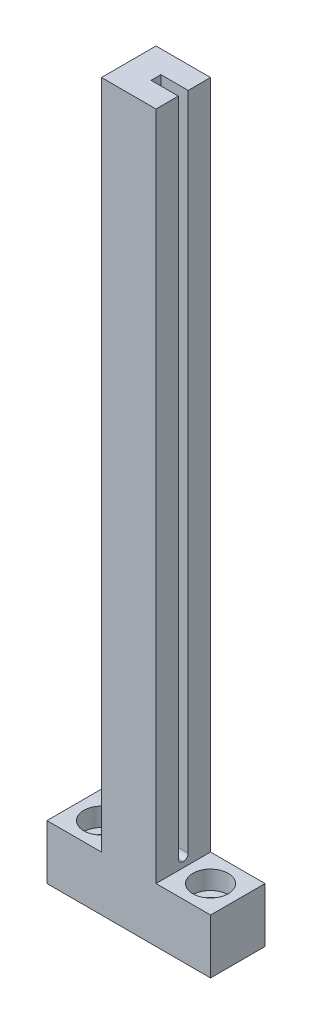
ISO-10303-21;
HEADER;
FILE_DESCRIPTION(('STEP AP214'),'2;1');
FILE_NAME('part.step','',(''),(''),'','','');
FILE_SCHEMA(('AUTOMOTIVE_DESIGN { 1 0 10303 214 1 1 1 1 }'));
ENDSEC;
DATA;
#1=APPLICATION_CONTEXT('core data for automotive mechanical design processes');
#2=APPLICATION_PROTOCOL_DEFINITION('international standard','automotive_design',2000,#1);
#3=PRODUCT_CONTEXT('',#1,'mechanical');
#4=PRODUCT('Part','Part','',(#3));
#5=PRODUCT_RELATED_PRODUCT_CATEGORY('part','',(#4));
#6=PRODUCT_DEFINITION_FORMATION('','',#4);
#7=PRODUCT_DEFINITION_CONTEXT('part definition',#1,'design');
#8=PRODUCT_DEFINITION('design','',#6,#7);
#9=PRODUCT_DEFINITION_SHAPE('','',#8);
#10=(LENGTH_UNIT() NAMED_UNIT(*) SI_UNIT(.MILLI.,.METRE.));
#11=(NAMED_UNIT(*) PLANE_ANGLE_UNIT() SI_UNIT($,.RADIAN.));
#12=(NAMED_UNIT(*) SI_UNIT($,.STERADIAN.) SOLID_ANGLE_UNIT());
#13=UNCERTAINTY_MEASURE_WITH_UNIT(LENGTH_MEASURE(1.E-05),#10,'distance_accuracy_value','');
#14=(GEOMETRIC_REPRESENTATION_CONTEXT(3) GLOBAL_UNCERTAINTY_ASSIGNED_CONTEXT((#13)) GLOBAL_UNIT_ASSIGNED_CONTEXT((#10,
#11,#12)) REPRESENTATION_CONTEXT('',''));
#15=CARTESIAN_POINT('',(0.,0.,0.));
#16=DIRECTION('',(0.,0.,1.));
#17=DIRECTION('',(1.,0.,0.));
#18=AXIS2_PLACEMENT_3D('',#15,#16,#17);
#19=CARTESIAN_POINT('',(5.,133.,-5.));
#20=DIRECTION('',(-1.,0.,0.));
#21=DIRECTION('',(0.,0.,1.));
#22=AXIS2_PLACEMENT_3D('',#19,#20,#21);
#23=PLANE('',#22);
#24=DIRECTION('',(0.,0.,1.));
#25=VECTOR('',#24,1.);
#26=CARTESIAN_POINT('',(5.,9.99999999999999,-5.));
#27=LINE('',#26,#25);
#28=CARTESIAN_POINT('',(5.,9.99999999999999,-5.));
#29=VERTEX_POINT('',#28);
#30=CARTESIAN_POINT('',(5.,10.,5.));
#31=VERTEX_POINT('',#30);
#32=EDGE_CURVE('E48',#29,#31,#27,.T.);
#33=ORIENTED_EDGE('',*,*,#32,.F.);
#34=DIRECTION('',(0.,-1.,0.));
#35=VECTOR('',#34,1.);
#36=CARTESIAN_POINT('',(5.,133.,-5.));
#37=LINE('',#36,#35);
#38=CARTESIAN_POINT('',(5.,133.,-5.));
#39=VERTEX_POINT('',#38);
#40=EDGE_CURVE('E239',#39,#29,#37,.T.);
#41=ORIENTED_EDGE('',*,*,#40,.F.);
#42=DIRECTION('',(0.,0.,-1.));
#43=VECTOR('',#42,1.);
#44=CARTESIAN_POINT('',(5.,133.,-5.));
#45=LINE('',#44,#43);
#46=CARTESIAN_POINT('',(5.,133.,-0.9));
#47=VERTEX_POINT('',#46);
#48=EDGE_CURVE('E224',#47,#39,#45,.T.);
#49=ORIENTED_EDGE('',*,*,#48,.F.);
#50=DIRECTION('',(0.,1.,0.));
#51=VECTOR('',#50,1.);
#52=CARTESIAN_POINT('',(5.,133.,-0.9));
#53=LINE('',#52,#51);
#54=CARTESIAN_POINT('',(5.,11.9,-0.899999999999986));
#55=VERTEX_POINT('',#54);
#56=EDGE_CURVE('E205',#55,#47,#53,.T.);
#57=ORIENTED_EDGE('',*,*,#56,.F.);
#58=CARTESIAN_POINT('',(5.,11.9,0.));
#59=DIRECTION('',(-1.,0.,0.));
#60=DIRECTION('',(0.,0.,1.));
#61=AXIS2_PLACEMENT_3D('',#58,#59,#60);
#62=CIRCLE('',#61,0.9);
#63=CARTESIAN_POINT('',(5.,11.,0.));
#64=VERTEX_POINT('',#63);
#65=EDGE_CURVE('E11',#55,#64,#62,.T.);
#66=ORIENTED_EDGE('',*,*,#65,.T.);
#67=CARTESIAN_POINT('',(5.,11.9,0.));
#68=DIRECTION('',(-1.,0.,0.));
#69=DIRECTION('',(0.,0.,1.));
#70=AXIS2_PLACEMENT_3D('',#67,#68,#69);
#71=CIRCLE('',#70,0.9);
#72=CARTESIAN_POINT('',(5.,11.9,0.899999999999985));
#73=VERTEX_POINT('',#72);
#74=EDGE_CURVE('E41',#64,#73,#71,.T.);
#75=ORIENTED_EDGE('',*,*,#74,.T.);
#76=DIRECTION('',(0.,-1.,0.));
#77=VECTOR('',#76,1.);
#78=CARTESIAN_POINT('',(5.,133.,0.9));
#79=LINE('',#78,#77);
#80=CARTESIAN_POINT('',(5.,133.,0.9));
#81=VERTEX_POINT('',#80);
#82=EDGE_CURVE('E211',#81,#73,#79,.T.);
#83=ORIENTED_EDGE('',*,*,#82,.F.);
#84=CARTESIAN_POINT('',(5.,133.,5.));
#85=VERTEX_POINT('',#84);
#86=EDGE_CURVE('E220',#85,#81,#45,.T.);
#87=ORIENTED_EDGE('',*,*,#86,.F.);
#88=DIRECTION('',(0.,-1.,0.));
#89=VECTOR('',#88,1.);
#90=CARTESIAN_POINT('',(5.,133.,5.));
#91=LINE('',#90,#89);
#92=EDGE_CURVE('E230',#85,#31,#91,.T.);
#93=ORIENTED_EDGE('',*,*,#92,.T.);
#94=EDGE_LOOP('',(#33,#41,#49,#57,#66,#75,#83,#87,#93));
#95=FACE_BOUND('',#94,.T.);
#96=ADVANCED_FACE('F32',(#95),#23,.F.);
#97=CARTESIAN_POINT('',(-5.,133.,-5.));
#98=DIRECTION('',(1.,0.,0.));
#99=DIRECTION('',(0.,0.,-1.));
#100=AXIS2_PLACEMENT_3D('',#97,#98,#99);
#101=PLANE('',#100);
#102=DIRECTION('',(0.,0.,-1.));
#103=VECTOR('',#102,1.);
#104=CARTESIAN_POINT('',(-5.,9.99999999999999,-5.));
#105=LINE('',#104,#103);
#106=CARTESIAN_POINT('',(-5.,9.99999999999999,5.));
#107=VERTEX_POINT('',#106);
#108=CARTESIAN_POINT('',(-5.,10.,-5.));
#109=VERTEX_POINT('',#108);
#110=EDGE_CURVE('E56',#107,#109,#105,.T.);
#111=ORIENTED_EDGE('',*,*,#110,.F.);
#112=DIRECTION('',(0.,-1.,0.));
#113=VECTOR('',#112,1.);
#114=CARTESIAN_POINT('',(-5.,133.,5.));
#115=LINE('',#114,#113);
#116=CARTESIAN_POINT('',(-5.,133.,5.));
#117=VERTEX_POINT('',#116);
#118=EDGE_CURVE('E235',#117,#107,#115,.T.);
#119=ORIENTED_EDGE('',*,*,#118,.F.);
#120=DIRECTION('',(0.,0.,1.));
#121=VECTOR('',#120,1.);
#122=CARTESIAN_POINT('',(-5.,133.,-5.));
#123=LINE('',#122,#121);
#124=CARTESIAN_POINT('',(-5.,133.,-5.));
#125=VERTEX_POINT('',#124);
#126=EDGE_CURVE('E226',#125,#117,#123,.T.);
#127=ORIENTED_EDGE('',*,*,#126,.F.);
#128=DIRECTION('',(0.,-1.,0.));
#129=VECTOR('',#128,1.);
#130=CARTESIAN_POINT('',(-5.,133.,-5.));
#131=LINE('',#130,#129);
#132=EDGE_CURVE('E237',#125,#109,#131,.T.);
#133=ORIENTED_EDGE('',*,*,#132,.T.);
#134=EDGE_LOOP('',(#111,#119,#127,#133));
#135=FACE_BOUND('',#134,.T.);
#136=ADVANCED_FACE('F283',(#135),#101,.F.);
#137=CARTESIAN_POINT('',(-5.,133.,-5.));
#138=DIRECTION('',(0.,0.,1.));
#139=DIRECTION('',(1.,0.,0.));
#140=AXIS2_PLACEMENT_3D('',#137,#138,#139);
#141=PLANE('',#140);
#142=DIRECTION('',(-1.,0.,0.));
#143=VECTOR('',#142,1.);
#144=CARTESIAN_POINT('',(-5.,0.,-5.));
#145=LINE('',#144,#143);
#146=CARTESIAN_POINT('',(15.,0.,-5.));
#147=VERTEX_POINT('',#146);
#148=CARTESIAN_POINT('',(-15.,0.,-5.));
#149=VERTEX_POINT('',#148);
#150=EDGE_CURVE('E217',#147,#149,#145,.T.);
#151=ORIENTED_EDGE('',*,*,#150,.T.);
#152=DIRECTION('',(0.,1.,0.));
#153=VECTOR('',#152,1.);
#154=CARTESIAN_POINT('',(-15.,0.,-5.));
#155=LINE('',#154,#153);
#156=CARTESIAN_POINT('',(-15.,10.,-5.));
#157=VERTEX_POINT('',#156);
#158=EDGE_CURVE('E187',#149,#157,#155,.T.);
#159=ORIENTED_EDGE('',*,*,#158,.T.);
#160=DIRECTION('',(-1.,0.,0.));
#161=VECTOR('',#160,1.);
#162=CARTESIAN_POINT('',(15.,10.,-5.));
#163=LINE('',#162,#161);
#164=EDGE_CURVE('E195',#109,#157,#163,.T.);
#165=ORIENTED_EDGE('',*,*,#164,.F.);
#166=ORIENTED_EDGE('',*,*,#132,.F.);
#167=DIRECTION('',(-1.,0.,0.));
#168=VECTOR('',#167,1.);
#169=CARTESIAN_POINT('',(-5.,133.,-5.));
#170=LINE('',#169,#168);
#171=EDGE_CURVE('E223',#39,#125,#170,.T.);
#172=ORIENTED_EDGE('',*,*,#171,.F.);
#173=ORIENTED_EDGE('',*,*,#40,.T.);
#174=CARTESIAN_POINT('',(15.,10.,-5.));
#175=VERTEX_POINT('',#174);
#176=EDGE_CURVE('E196',#175,#29,#163,.T.);
#177=ORIENTED_EDGE('',*,*,#176,.F.);
#178=DIRECTION('',(0.,1.,0.));
#179=VECTOR('',#178,1.);
#180=CARTESIAN_POINT('',(15.,0.,-5.));
#181=LINE('',#180,#179);
#182=EDGE_CURVE('E177',#147,#175,#181,.T.);
#183=ORIENTED_EDGE('',*,*,#182,.F.);
#184=EDGE_LOOP('',(#151,#159,#165,#166,#172,#173,#177,#183));
#185=FACE_BOUND('',#184,.T.);
#186=ADVANCED_FACE('F279',(#185),#141,.F.);
#187=CARTESIAN_POINT('',(-5.,133.,5.));
#188=DIRECTION('',(0.,0.,-1.));
#189=DIRECTION('',(-1.,0.,0.));
#190=AXIS2_PLACEMENT_3D('',#187,#188,#189);
#191=PLANE('',#190);
#192=DIRECTION('',(1.,0.,0.));
#193=VECTOR('',#192,1.);
#194=CARTESIAN_POINT('',(-5.,0.,5.));
#195=LINE('',#194,#193);
#196=CARTESIAN_POINT('',(-15.,0.,5.));
#197=VERTEX_POINT('',#196);
#198=CARTESIAN_POINT('',(15.,0.,5.));
#199=VERTEX_POINT('',#198);
#200=EDGE_CURVE('E232',#197,#199,#195,.T.);
#201=ORIENTED_EDGE('',*,*,#200,.T.);
#202=DIRECTION('',(0.,-1.,0.));
#203=VECTOR('',#202,1.);
#204=CARTESIAN_POINT('',(15.,0.,5.));
#205=LINE('',#204,#203);
#206=CARTESIAN_POINT('',(15.,10.,5.));
#207=VERTEX_POINT('',#206);
#208=EDGE_CURVE('E170',#207,#199,#205,.T.);
#209=ORIENTED_EDGE('',*,*,#208,.F.);
#210=DIRECTION('',(-1.,0.,0.));
#211=VECTOR('',#210,1.);
#212=CARTESIAN_POINT('',(15.,10.,5.));
#213=LINE('',#212,#211);
#214=EDGE_CURVE('E192',#207,#31,#213,.T.);
#215=ORIENTED_EDGE('',*,*,#214,.T.);
#216=ORIENTED_EDGE('',*,*,#92,.F.);
#217=DIRECTION('',(1.,0.,0.));
#218=VECTOR('',#217,1.);
#219=CARTESIAN_POINT('',(-5.,133.,5.));
#220=LINE('',#219,#218);
#221=EDGE_CURVE('E228',#117,#85,#220,.T.);
#222=ORIENTED_EDGE('',*,*,#221,.F.);
#223=ORIENTED_EDGE('',*,*,#118,.T.);
#224=CARTESIAN_POINT('',(-15.,10.,5.));
#225=VERTEX_POINT('',#224);
#226=EDGE_CURVE('E181',#107,#225,#213,.T.);
#227=ORIENTED_EDGE('',*,*,#226,.T.);
#228=DIRECTION('',(0.,-1.,0.));
#229=VECTOR('',#228,1.);
#230=CARTESIAN_POINT('',(-15.,0.,5.));
#231=LINE('',#230,#229);
#232=EDGE_CURVE('E169',#225,#197,#231,.T.);
#233=ORIENTED_EDGE('',*,*,#232,.T.);
#234=EDGE_LOOP('',(#201,#209,#215,#216,#222,#223,#227,#233));
#235=FACE_BOUND('',#234,.T.);
#236=ADVANCED_FACE('F287',(#235),#191,.F.);
#237=CARTESIAN_POINT('',(0.,133.,0.));
#238=DIRECTION('',(0.,1.,0.));
#239=DIRECTION('',(0.,0.,1.));
#240=AXIS2_PLACEMENT_3D('',#237,#238,#239);
#241=PLANE('',#240);
#242=DIRECTION('',(1.,0.,0.));
#243=VECTOR('',#242,1.);
#244=CARTESIAN_POINT('',(0.,133.,0.9));
#245=LINE('',#244,#243);
#246=CARTESIAN_POINT('',(0.,133.,0.9));
#247=VERTEX_POINT('',#246);
#248=EDGE_CURVE('E215',#247,#81,#245,.T.);
#249=ORIENTED_EDGE('',*,*,#248,.F.);
#250=DIRECTION('',(0.,0.,1.));
#251=VECTOR('',#250,1.);
#252=CARTESIAN_POINT('',(0.,133.,0.9));
#253=LINE('',#252,#251);
#254=CARTESIAN_POINT('',(0.,133.,-0.9));
#255=VERTEX_POINT('',#254);
#256=EDGE_CURVE('E207',#255,#247,#253,.T.);
#257=ORIENTED_EDGE('',*,*,#256,.F.);
#258=DIRECTION('',(1.,0.,0.));
#259=VECTOR('',#258,1.);
#260=CARTESIAN_POINT('',(0.,133.,-0.9));
#261=LINE('',#260,#259);
#262=EDGE_CURVE('E210',#255,#47,#261,.T.);
#263=ORIENTED_EDGE('',*,*,#262,.T.);
#264=ORIENTED_EDGE('',*,*,#48,.T.);
#265=ORIENTED_EDGE('',*,*,#171,.T.);
#266=ORIENTED_EDGE('',*,*,#126,.T.);
#267=ORIENTED_EDGE('',*,*,#221,.T.);
#268=ORIENTED_EDGE('',*,*,#86,.T.);
#269=EDGE_LOOP('',(#249,#257,#263,#264,#265,#266,#267,#268));
#270=FACE_BOUND('',#269,.T.);
#271=ADVANCED_FACE('F275',(#270),#241,.T.);
#272=CARTESIAN_POINT('',(0.,0.,0.));
#273=DIRECTION('',(0.,1.,0.));
#274=DIRECTION('',(0.,0.,1.));
#275=AXIS2_PLACEMENT_3D('',#272,#273,#274);
#276=PLANE('',#275);
#277=CARTESIAN_POINT('',(0.,0.,0.));
#278=DIRECTION('',(0.,-1.,0.));
#279=DIRECTION('',(0.,0.,-1.));
#280=AXIS2_PLACEMENT_3D('',#277,#278,#279);
#281=CIRCLE('',#280,0.49999999999999);
#282=CARTESIAN_POINT('',(0.,0.,-0.49999999999999));
#283=VERTEX_POINT('',#282);
#284=EDGE_CURVE('E141',#283,#283,#281,.T.);
#285=ORIENTED_EDGE('',*,*,#284,.F.);
#286=EDGE_LOOP('',(#285));
#287=FACE_BOUND('',#286,.T.);
#288=CARTESIAN_POINT('',(-10.,0.,0.));
#289=DIRECTION('',(0.,1.,0.));
#290=DIRECTION('',(0.,0.,1.));
#291=AXIS2_PLACEMENT_3D('',#288,#289,#290);
#292=CIRCLE('',#291,1.7);
#293=CARTESIAN_POINT('',(-10.,0.,1.7));
#294=VERTEX_POINT('',#293);
#295=EDGE_CURVE('E154',#294,#294,#292,.T.);
#296=ORIENTED_EDGE('',*,*,#295,.T.);
#297=EDGE_LOOP('',(#296));
#298=FACE_BOUND('',#297,.T.);
#299=CARTESIAN_POINT('',(10.,0.,0.));
#300=DIRECTION('',(0.,1.,0.));
#301=DIRECTION('',(0.,0.,1.));
#302=AXIS2_PLACEMENT_3D('',#299,#300,#301);
#303=CIRCLE('',#302,1.7);
#304=CARTESIAN_POINT('',(10.,0.,1.7));
#305=VERTEX_POINT('',#304);
#306=EDGE_CURVE('E166',#305,#305,#303,.T.);
#307=ORIENTED_EDGE('',*,*,#306,.T.);
#308=EDGE_LOOP('',(#307));
#309=FACE_BOUND('',#308,.T.);
#310=ORIENTED_EDGE('',*,*,#150,.F.);
#311=DIRECTION('',(0.,0.,-1.));
#312=VECTOR('',#311,1.);
#313=CARTESIAN_POINT('',(15.,0.,5.));
#314=LINE('',#313,#312);
#315=EDGE_CURVE('E173',#199,#147,#314,.T.);
#316=ORIENTED_EDGE('',*,*,#315,.F.);
#317=ORIENTED_EDGE('',*,*,#200,.F.);
#318=DIRECTION('',(0.,0.,-1.));
#319=VECTOR('',#318,1.);
#320=CARTESIAN_POINT('',(-15.,0.,5.));
#321=LINE('',#320,#319);
#322=EDGE_CURVE('E184',#197,#149,#321,.T.);
#323=ORIENTED_EDGE('',*,*,#322,.T.);
#324=EDGE_LOOP('',(#310,#316,#317,#323));
#325=FACE_BOUND('',#324,.T.);
#326=ADVANCED_FACE('F298',(#287,#298,#309,#325),#276,.F.);
#327=CARTESIAN_POINT('',(0.,133.,0.9));
#328=DIRECTION('',(0.,0.,1.));
#329=DIRECTION('',(0.,-1.,0.));
#330=AXIS2_PLACEMENT_3D('',#327,#328,#329);
#331=PLANE('',#330);
#332=ORIENTED_EDGE('',*,*,#82,.T.);
#333=DIRECTION('',(1.,0.,0.));
#334=VECTOR('',#333,1.);
#335=CARTESIAN_POINT('',(0.,11.9,0.899999999999985));
#336=LINE('',#335,#334);
#337=CARTESIAN_POINT('',(0.,11.9,0.899999999999985));
#338=VERTEX_POINT('',#337);
#339=EDGE_CURVE('E241',#73,#338,#336,.F.);
#340=ORIENTED_EDGE('',*,*,#339,.T.);
#341=DIRECTION('',(0.,-1.,0.));
#342=VECTOR('',#341,1.);
#343=CARTESIAN_POINT('',(0.,133.,0.9));
#344=LINE('',#343,#342);
#345=EDGE_CURVE('E201',#247,#338,#344,.T.);
#346=ORIENTED_EDGE('',*,*,#345,.F.);
#347=ORIENTED_EDGE('',*,*,#248,.T.);
#348=EDGE_LOOP('',(#332,#340,#346,#347));
#349=FACE_BOUND('',#348,.T.);
#350=ADVANCED_FACE('F260',(#349),#331,.F.);
#351=CARTESIAN_POINT('',(0.,133.,-0.9));
#352=DIRECTION('',(0.,0.,-1.));
#353=DIRECTION('',(0.,1.,0.));
#354=AXIS2_PLACEMENT_3D('',#351,#352,#353);
#355=PLANE('',#354);
#356=DIRECTION('',(0.,1.,0.));
#357=VECTOR('',#356,1.);
#358=CARTESIAN_POINT('',(0.,133.,-0.9));
#359=LINE('',#358,#357);
#360=CARTESIAN_POINT('',(0.,11.9,-0.899999999999985));
#361=VERTEX_POINT('',#360);
#362=EDGE_CURVE('E204',#361,#255,#359,.T.);
#363=ORIENTED_EDGE('',*,*,#362,.F.);
#364=DIRECTION('',(1.,0.,0.));
#365=VECTOR('',#364,1.);
#366=CARTESIAN_POINT('',(5.,11.9,-0.899999999999986));
#367=LINE('',#366,#365);
#368=EDGE_CURVE('E248',#361,#55,#367,.T.);
#369=ORIENTED_EDGE('',*,*,#368,.T.);
#370=ORIENTED_EDGE('',*,*,#56,.T.);
#371=ORIENTED_EDGE('',*,*,#262,.F.);
#372=EDGE_LOOP('',(#363,#369,#370,#371));
#373=FACE_BOUND('',#372,.T.);
#374=ADVANCED_FACE('F270',(#373),#355,.F.);
#375=CARTESIAN_POINT('',(0.,0.,0.));
#376=DIRECTION('',(1.,0.,0.));
#377=DIRECTION('',(0.,0.,-1.));
#378=AXIS2_PLACEMENT_3D('',#375,#376,#377);
#379=PLANE('',#378);
#380=ORIENTED_EDGE('',*,*,#345,.T.);
#381=CARTESIAN_POINT('',(0.,11.9,0.));
#382=DIRECTION('',(1.,0.,0.));
#383=DIRECTION('',(0.,0.,-1.));
#384=AXIS2_PLACEMENT_3D('',#381,#382,#383);
#385=CIRCLE('',#384,0.9);
#386=CARTESIAN_POINT('',(0.,11.,0.));
#387=VERTEX_POINT('',#386);
#388=EDGE_CURVE('E246',#338,#387,#385,.T.);
#389=ORIENTED_EDGE('',*,*,#388,.T.);
#390=CARTESIAN_POINT('',(0.,11.9,0.));
#391=DIRECTION('',(1.,0.,0.));
#392=DIRECTION('',(0.,0.,-1.));
#393=AXIS2_PLACEMENT_3D('',#390,#391,#392);
#394=CIRCLE('',#393,0.9);
#395=EDGE_CURVE('E244',#387,#361,#394,.T.);
#396=ORIENTED_EDGE('',*,*,#395,.T.);
#397=ORIENTED_EDGE('',*,*,#362,.T.);
#398=ORIENTED_EDGE('',*,*,#256,.T.);
#399=EDGE_LOOP('',(#380,#389,#396,#397,#398));
#400=FACE_BOUND('',#399,.T.);
#401=ADVANCED_FACE('F265',(#400),#379,.T.);
#402=CARTESIAN_POINT('',(0.,11.9,0.));
#403=DIRECTION('',(-1.,0.,0.));
#404=DIRECTION('',(0.,0.,1.));
#405=AXIS2_PLACEMENT_3D('',#402,#403,#404);
#406=CYLINDRICAL_SURFACE('',#405,0.9);
#407=ORIENTED_EDGE('',*,*,#368,.F.);
#408=ORIENTED_EDGE('',*,*,#395,.F.);
#409=DIRECTION('',(1.,0.,0.));
#410=VECTOR('',#409,1.);
#411=CARTESIAN_POINT('',(0.,11.,0.));
#412=LINE('',#411,#410);
#413=EDGE_CURVE('E36',#64,#387,#412,.F.);
#414=ORIENTED_EDGE('',*,*,#413,.F.);
#415=ORIENTED_EDGE('',*,*,#65,.F.);
#416=EDGE_LOOP('',(#407,#408,#414,#415));
#417=FACE_BOUND('',#416,.T.);
#418=ADVANCED_FACE('F34',(#417),#406,.F.);
#419=CARTESIAN_POINT('',(0.,11.9,0.));
#420=DIRECTION('',(-1.,0.,0.));
#421=DIRECTION('',(0.,0.,1.));
#422=AXIS2_PLACEMENT_3D('',#419,#420,#421);
#423=CYLINDRICAL_SURFACE('',#422,0.9);
#424=ORIENTED_EDGE('',*,*,#388,.F.);
#425=ORIENTED_EDGE('',*,*,#339,.F.);
#426=ORIENTED_EDGE('',*,*,#74,.F.);
#427=ORIENTED_EDGE('',*,*,#413,.T.);
#428=EDGE_LOOP('',(#424,#425,#426,#427));
#429=FACE_BOUND('',#428,.T.);
#430=ADVANCED_FACE('F262',(#429),#423,.F.);
#431=CARTESIAN_POINT('',(-15.,0.,0.));
#432=DIRECTION('',(-1.,0.,0.));
#433=DIRECTION('',(0.,0.,1.));
#434=AXIS2_PLACEMENT_3D('',#431,#432,#433);
#435=PLANE('',#434);
#436=ORIENTED_EDGE('',*,*,#232,.F.);
#437=DIRECTION('',(0.,0.,1.));
#438=VECTOR('',#437,1.);
#439=CARTESIAN_POINT('',(-15.,10.,5.));
#440=LINE('',#439,#438);
#441=EDGE_CURVE('E174',#157,#225,#440,.T.);
#442=ORIENTED_EDGE('',*,*,#441,.F.);
#443=ORIENTED_EDGE('',*,*,#158,.F.);
#444=ORIENTED_EDGE('',*,*,#322,.F.);
#445=EDGE_LOOP('',(#436,#442,#443,#444));
#446=FACE_BOUND('',#445,.T.);
#447=ADVANCED_FACE('F304',(#446),#435,.T.);
#448=CARTESIAN_POINT('',(15.,10.,5.));
#449=DIRECTION('',(0.,-1.,0.));
#450=DIRECTION('',(0.,0.,-1.));
#451=AXIS2_PLACEMENT_3D('',#448,#449,#450);
#452=PLANE('',#451);
#453=CARTESIAN_POINT('',(-10.,10.,0.));
#454=DIRECTION('',(0.,1.,0.));
#455=DIRECTION('',(0.,0.,1.));
#456=AXIS2_PLACEMENT_3D('',#453,#454,#455);
#457=CIRCLE('',#456,3.25);
#458=CARTESIAN_POINT('',(-10.,10.,3.25));
#459=VERTEX_POINT('',#458);
#460=EDGE_CURVE('E140',#459,#459,#457,.T.);
#461=ORIENTED_EDGE('',*,*,#460,.F.);
#462=EDGE_LOOP('',(#461));
#463=FACE_BOUND('',#462,.T.);
#464=ORIENTED_EDGE('',*,*,#226,.F.);
#465=ORIENTED_EDGE('',*,*,#110,.T.);
#466=ORIENTED_EDGE('',*,*,#164,.T.);
#467=ORIENTED_EDGE('',*,*,#441,.T.);
#468=EDGE_LOOP('',(#464,#465,#466,#467));
#469=FACE_BOUND('',#468,.T.);
#470=ADVANCED_FACE('F307',(#463,#469),#452,.F.);
#471=CARTESIAN_POINT('',(10.,10.,0.));
#472=DIRECTION('',(0.,1.,0.));
#473=DIRECTION('',(0.,0.,1.));
#474=AXIS2_PLACEMENT_3D('',#471,#472,#473);
#475=CIRCLE('',#474,3.25);
#476=CARTESIAN_POINT('',(10.,10.,3.25));
#477=VERTEX_POINT('',#476);
#478=EDGE_CURVE('E157',#477,#477,#475,.T.);
#479=ORIENTED_EDGE('',*,*,#478,.F.);
#480=EDGE_LOOP('',(#479));
#481=FACE_BOUND('',#480,.T.);
#482=ORIENTED_EDGE('',*,*,#176,.T.);
#483=ORIENTED_EDGE('',*,*,#32,.T.);
#484=ORIENTED_EDGE('',*,*,#214,.F.);
#485=DIRECTION('',(0.,0.,1.));
#486=VECTOR('',#485,1.);
#487=CARTESIAN_POINT('',(15.,10.,5.));
#488=LINE('',#487,#486);
#489=EDGE_CURVE('E179',#175,#207,#488,.T.);
#490=ORIENTED_EDGE('',*,*,#489,.F.);
#491=EDGE_LOOP('',(#482,#483,#484,#490));
#492=FACE_BOUND('',#491,.T.);
#493=ADVANCED_FACE('F291',(#481,#492),#452,.F.);
#494=CARTESIAN_POINT('',(15.,0.,0.));
#495=DIRECTION('',(-1.,0.,0.));
#496=DIRECTION('',(0.,0.,1.));
#497=AXIS2_PLACEMENT_3D('',#494,#495,#496);
#498=PLANE('',#497);
#499=ORIENTED_EDGE('',*,*,#208,.T.);
#500=ORIENTED_EDGE('',*,*,#315,.T.);
#501=ORIENTED_EDGE('',*,*,#182,.T.);
#502=ORIENTED_EDGE('',*,*,#489,.T.);
#503=EDGE_LOOP('',(#499,#500,#501,#502));
#504=FACE_BOUND('',#503,.T.);
#505=ADVANCED_FACE('F295',(#504),#498,.F.);
#506=CARTESIAN_POINT('',(10.,10.,0.));
#507=DIRECTION('',(0.,1.,0.));
#508=DIRECTION('',(0.,0.,1.));
#509=AXIS2_PLACEMENT_3D('',#506,#507,#508);
#510=CYLINDRICAL_SURFACE('',#509,1.7);
#511=ORIENTED_EDGE('',*,*,#306,.F.);
#512=EDGE_LOOP('',(#511));
#513=FACE_BOUND('',#512,.T.);
#514=CARTESIAN_POINT('',(10.,6.6,0.));
#515=DIRECTION('',(0.,1.,0.));
#516=DIRECTION('',(0.,0.,1.));
#517=AXIS2_PLACEMENT_3D('',#514,#515,#516);
#518=CIRCLE('',#517,1.7);
#519=CARTESIAN_POINT('',(10.,6.6,1.7));
#520=VERTEX_POINT('',#519);
#521=EDGE_CURVE('E163',#520,#520,#518,.T.);
#522=ORIENTED_EDGE('',*,*,#521,.T.);
#523=EDGE_LOOP('',(#522));
#524=FACE_BOUND('',#523,.T.);
#525=ADVANCED_FACE('F441',(#513,#524),#510,.F.);
#526=CARTESIAN_POINT('',(11.7,6.6,0.));
#527=DIRECTION('',(0.,-1.,0.));
#528=DIRECTION('',(0.,0.,-1.));
#529=AXIS2_PLACEMENT_3D('',#526,#527,#528);
#530=PLANE('',#529);
#531=ORIENTED_EDGE('',*,*,#521,.F.);
#532=EDGE_LOOP('',(#531));
#533=FACE_BOUND('',#532,.T.);
#534=CARTESIAN_POINT('',(10.,6.6,0.));
#535=DIRECTION('',(0.,1.,0.));
#536=DIRECTION('',(0.,0.,1.));
#537=AXIS2_PLACEMENT_3D('',#534,#535,#536);
#538=CIRCLE('',#537,3.25);
#539=CARTESIAN_POINT('',(10.,6.6,3.25));
#540=VERTEX_POINT('',#539);
#541=EDGE_CURVE('E160',#540,#540,#538,.T.);
#542=ORIENTED_EDGE('',*,*,#541,.T.);
#543=EDGE_LOOP('',(#542));
#544=FACE_BOUND('',#543,.T.);
#545=ADVANCED_FACE('F437',(#533,#544),#530,.F.);
#546=CARTESIAN_POINT('',(10.,10.,0.));
#547=DIRECTION('',(0.,1.,0.));
#548=DIRECTION('',(0.,0.,1.));
#549=AXIS2_PLACEMENT_3D('',#546,#547,#548);
#550=CYLINDRICAL_SURFACE('',#549,3.25);
#551=ORIENTED_EDGE('',*,*,#541,.F.);
#552=EDGE_LOOP('',(#551));
#553=FACE_BOUND('',#552,.T.);
#554=ORIENTED_EDGE('',*,*,#478,.T.);
#555=EDGE_LOOP('',(#554));
#556=FACE_BOUND('',#555,.T.);
#557=ADVANCED_FACE('F433',(#553,#556),#550,.F.);
#558=CARTESIAN_POINT('',(-10.,10.,0.));
#559=DIRECTION('',(0.,1.,0.));
#560=DIRECTION('',(0.,0.,1.));
#561=AXIS2_PLACEMENT_3D('',#558,#559,#560);
#562=CYLINDRICAL_SURFACE('',#561,1.7);
#563=ORIENTED_EDGE('',*,*,#295,.F.);
#564=EDGE_LOOP('',(#563));
#565=FACE_BOUND('',#564,.T.);
#566=CARTESIAN_POINT('',(-10.,6.6,0.));
#567=DIRECTION('',(0.,1.,0.));
#568=DIRECTION('',(0.,0.,1.));
#569=AXIS2_PLACEMENT_3D('',#566,#567,#568);
#570=CIRCLE('',#569,1.7);
#571=CARTESIAN_POINT('',(-10.,6.6,1.7));
#572=VERTEX_POINT('',#571);
#573=EDGE_CURVE('E151',#572,#572,#570,.T.);
#574=ORIENTED_EDGE('',*,*,#573,.T.);
#575=EDGE_LOOP('',(#574));
#576=FACE_BOUND('',#575,.T.);
#577=ADVANCED_FACE('F429',(#565,#576),#562,.F.);
#578=CARTESIAN_POINT('',(-8.3,6.6,0.));
#579=DIRECTION('',(0.,-1.,0.));
#580=DIRECTION('',(0.,0.,-1.));
#581=AXIS2_PLACEMENT_3D('',#578,#579,#580);
#582=PLANE('',#581);
#583=ORIENTED_EDGE('',*,*,#573,.F.);
#584=EDGE_LOOP('',(#583));
#585=FACE_BOUND('',#584,.T.);
#586=CARTESIAN_POINT('',(-10.,6.6,0.));
#587=DIRECTION('',(0.,1.,0.));
#588=DIRECTION('',(0.,0.,1.));
#589=AXIS2_PLACEMENT_3D('',#586,#587,#588);
#590=CIRCLE('',#589,3.25);
#591=CARTESIAN_POINT('',(-10.,6.6,3.25));
#592=VERTEX_POINT('',#591);
#593=EDGE_CURVE('E144',#592,#592,#590,.T.);
#594=ORIENTED_EDGE('',*,*,#593,.T.);
#595=EDGE_LOOP('',(#594));
#596=FACE_BOUND('',#595,.T.);
#597=ADVANCED_FACE('F425',(#585,#596),#582,.F.);
#598=CARTESIAN_POINT('',(-10.,10.,0.));
#599=DIRECTION('',(0.,1.,0.));
#600=DIRECTION('',(0.,0.,1.));
#601=AXIS2_PLACEMENT_3D('',#598,#599,#600);
#602=CYLINDRICAL_SURFACE('',#601,3.25);
#603=ORIENTED_EDGE('',*,*,#593,.F.);
#604=EDGE_LOOP('',(#603));
#605=FACE_BOUND('',#604,.T.);
#606=ORIENTED_EDGE('',*,*,#460,.T.);
#607=EDGE_LOOP('',(#606));
#608=FACE_BOUND('',#607,.T.);
#609=ADVANCED_FACE('F134',(#605,#608),#602,.F.);
#610=CARTESIAN_POINT('',(0.,8.,0.));
#611=DIRECTION('',(0.,-1.,0.));
#612=DIRECTION('',(0.,0.,-1.));
#613=AXIS2_PLACEMENT_3D('',#610,#611,#612);
#614=CONICAL_SURFACE('',#613,0.499999999999998,1.02974425867665);
#615=CARTESIAN_POINT('',(0.,8.30043030951378,0.));
#616=VERTEX_POINT('',#615);
#617=VERTEX_LOOP('',#616);
#618=FACE_BOUND('',#617,.T.);
#619=CARTESIAN_POINT('',(0.,8.,0.));
#620=DIRECTION('',(0.,-1.,0.));
#621=DIRECTION('',(0.,0.,-1.));
#622=AXIS2_PLACEMENT_3D('',#619,#620,#621);
#623=CIRCLE('',#622,0.499999999999998);
#624=CARTESIAN_POINT('',(0.,8.,-0.499999999999998));
#625=VERTEX_POINT('',#624);
#626=EDGE_CURVE('E138',#625,#625,#623,.T.);
#627=ORIENTED_EDGE('',*,*,#626,.T.);
#628=EDGE_LOOP('',(#627));
#629=FACE_BOUND('',#628,.T.);
#630=ADVANCED_FACE('F130',(#618,#629),#614,.F.);
#631=CARTESIAN_POINT('',(0.,0.,0.));
#632=DIRECTION('',(0.,-1.,0.));
#633=DIRECTION('',(0.,0.,-1.));
#634=AXIS2_PLACEMENT_3D('',#631,#632,#633);
#635=CYLINDRICAL_SURFACE('',#634,0.499999999999994);
#636=ORIENTED_EDGE('',*,*,#626,.F.);
#637=EDGE_LOOP('',(#636));
#638=FACE_BOUND('',#637,.T.);
#639=ORIENTED_EDGE('',*,*,#284,.T.);
#640=EDGE_LOOP('',(#639));
#641=FACE_BOUND('',#640,.T.);
#642=ADVANCED_FACE('F133',(#638,#641),#635,.F.);
#643=CLOSED_SHELL('',(#96,#136,#186,#236,#271,#326,#350,#374,#401,#418,#430,#447,#470,#493,#505,
#525,#545,#557,#577,#597,#609,#630,#642));
#644=MANIFOLD_SOLID_BREP('B2',#643);
#645=ADVANCED_BREP_SHAPE_REPRESENTATION('',(#18,#644),#14);
#646=SHAPE_DEFINITION_REPRESENTATION(#9,#645);
ENDSEC;
END-ISO-10303-21;
